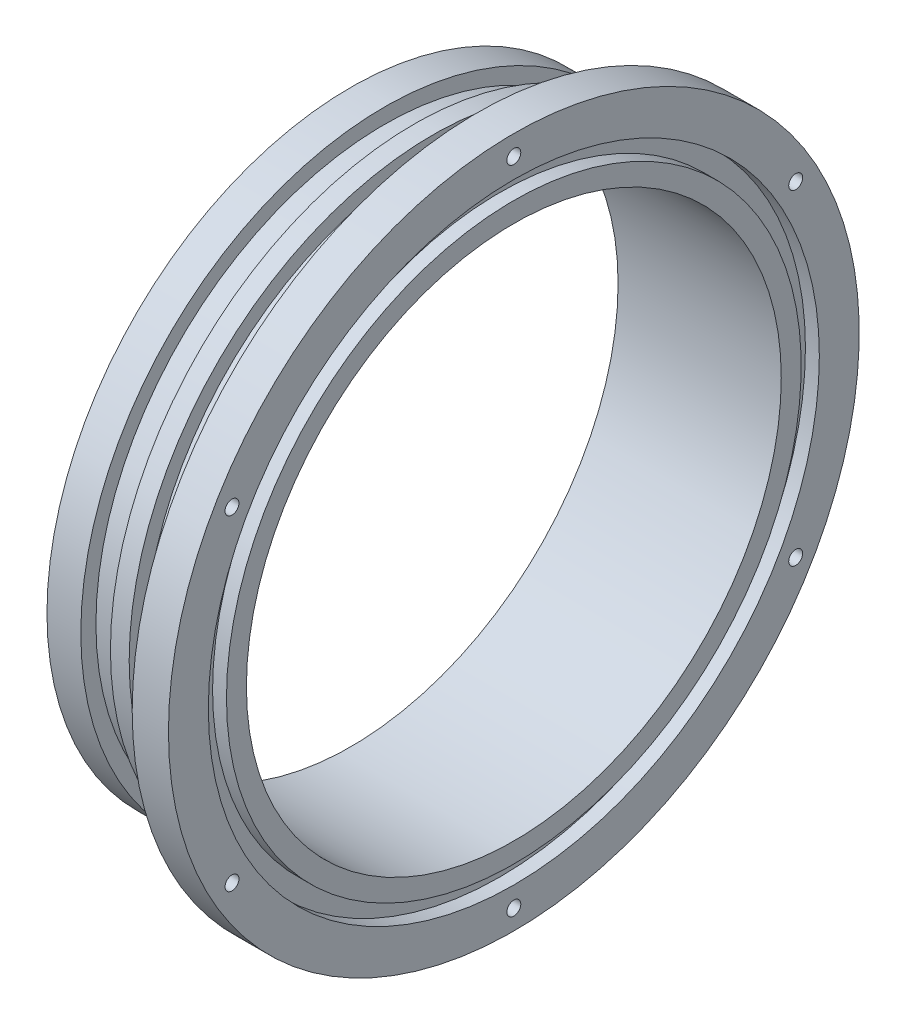
ISO-10303-21;
HEADER;
FILE_DESCRIPTION(('STEP AP214'),'2;1');
FILE_NAME('part.step','',(''),(''),'','','');
FILE_SCHEMA(('AUTOMOTIVE_DESIGN { 1 0 10303 214 1 1 1 1 }'));
ENDSEC;
DATA;
#1=APPLICATION_CONTEXT('core data for automotive mechanical design processes');
#2=APPLICATION_PROTOCOL_DEFINITION('international standard','automotive_design',2000,#1);
#3=PRODUCT_CONTEXT('',#1,'mechanical');
#4=PRODUCT('Part','Part','',(#3));
#5=PRODUCT_RELATED_PRODUCT_CATEGORY('part','',(#4));
#6=PRODUCT_DEFINITION_FORMATION('','',#4);
#7=PRODUCT_DEFINITION_CONTEXT('part definition',#1,'design');
#8=PRODUCT_DEFINITION('design','',#6,#7);
#9=PRODUCT_DEFINITION_SHAPE('','',#8);
#10=(LENGTH_UNIT() NAMED_UNIT(*) SI_UNIT(.MILLI.,.METRE.));
#11=(NAMED_UNIT(*) PLANE_ANGLE_UNIT() SI_UNIT($,.RADIAN.));
#12=(NAMED_UNIT(*) SI_UNIT($,.STERADIAN.) SOLID_ANGLE_UNIT());
#13=UNCERTAINTY_MEASURE_WITH_UNIT(LENGTH_MEASURE(1.E-05),#10,'distance_accuracy_value','');
#14=(GEOMETRIC_REPRESENTATION_CONTEXT(3) GLOBAL_UNCERTAINTY_ASSIGNED_CONTEXT((#13)) GLOBAL_UNIT_ASSIGNED_CONTEXT((#10,
#11,#12)) REPRESENTATION_CONTEXT('',''));
#15=CARTESIAN_POINT('',(0.,0.,0.));
#16=DIRECTION('',(0.,0.,1.));
#17=DIRECTION('',(1.,0.,0.));
#18=AXIS2_PLACEMENT_3D('',#15,#16,#17);
#19=CARTESIAN_POINT('',(0.,50.25,0.));
#20=DIRECTION('',(1.,0.,0.));
#21=DIRECTION('',(0.,0.,-1.));
#22=AXIS2_PLACEMENT_3D('',#19,#20,#21);
#23=PLANE('',#22);
#24=CARTESIAN_POINT('',(0.,0.,-47.));
#25=DIRECTION('',(-1.,0.,0.));
#26=DIRECTION('',(0.,0.,1.));
#27=AXIS2_PLACEMENT_3D('',#24,#25,#26);
#28=CIRCLE('',#27,1.15);
#29=CARTESIAN_POINT('',(0.,0.,-45.85));
#30=VERTEX_POINT('',#29);
#31=EDGE_CURVE('E254',#30,#30,#28,.T.);
#32=ORIENTED_EDGE('',*,*,#31,.F.);
#33=EDGE_LOOP('',(#32));
#34=FACE_BOUND('',#33,.T.);
#35=CARTESIAN_POINT('',(0.,47.,0.));
#36=DIRECTION('',(-1.,0.,0.));
#37=DIRECTION('',(0.,0.,1.));
#38=AXIS2_PLACEMENT_3D('',#35,#36,#37);
#39=CIRCLE('',#38,1.15);
#40=CARTESIAN_POINT('',(0.,47.,1.15));
#41=VERTEX_POINT('',#40);
#42=EDGE_CURVE('E265',#41,#41,#39,.T.);
#43=ORIENTED_EDGE('',*,*,#42,.F.);
#44=EDGE_LOOP('',(#43));
#45=FACE_BOUND('',#44,.T.);
#46=CARTESIAN_POINT('',(0.,0.,47.));
#47=DIRECTION('',(-1.,0.,0.));
#48=DIRECTION('',(0.,0.,1.));
#49=AXIS2_PLACEMENT_3D('',#46,#47,#48);
#50=CIRCLE('',#49,1.15);
#51=CARTESIAN_POINT('',(0.,0.,48.15));
#52=VERTEX_POINT('',#51);
#53=EDGE_CURVE('E271',#52,#52,#50,.T.);
#54=ORIENTED_EDGE('',*,*,#53,.F.);
#55=EDGE_LOOP('',(#54));
#56=FACE_BOUND('',#55,.T.);
#57=CARTESIAN_POINT('',(0.,-47.,0.));
#58=DIRECTION('',(-1.,0.,0.));
#59=DIRECTION('',(0.,0.,1.));
#60=AXIS2_PLACEMENT_3D('',#57,#58,#59);
#61=CIRCLE('',#60,1.15);
#62=CARTESIAN_POINT('',(0.,-47.,1.15));
#63=VERTEX_POINT('',#62);
#64=EDGE_CURVE('E253',#63,#63,#61,.T.);
#65=ORIENTED_EDGE('',*,*,#64,.F.);
#66=EDGE_LOOP('',(#65));
#67=FACE_BOUND('',#66,.T.);
#68=CARTESIAN_POINT('',(0.,0.,0.));
#69=DIRECTION('',(-1.,0.,0.));
#70=DIRECTION('',(0.,0.,1.));
#71=AXIS2_PLACEMENT_3D('',#68,#69,#70);
#72=CIRCLE('',#71,44.25);
#73=CARTESIAN_POINT('',(0.,0.,44.25));
#74=VERTEX_POINT('',#73);
#75=EDGE_CURVE('E10',#74,#74,#72,.T.);
#76=ORIENTED_EDGE('',*,*,#75,.F.);
#77=EDGE_LOOP('',(#76));
#78=FACE_BOUND('',#77,.T.);
#79=CARTESIAN_POINT('',(0.,0.,0.));
#80=DIRECTION('',(-1.,0.,0.));
#81=DIRECTION('',(0.,0.,1.));
#82=AXIS2_PLACEMENT_3D('',#79,#80,#81);
#83=CIRCLE('',#82,50.25);
#84=CARTESIAN_POINT('',(0.,0.,50.25));
#85=VERTEX_POINT('',#84);
#86=EDGE_CURVE('E49',#85,#85,#83,.T.);
#87=ORIENTED_EDGE('',*,*,#86,.T.);
#88=EDGE_LOOP('',(#87));
#89=FACE_BOUND('',#88,.T.);
#90=ADVANCED_FACE('F30',(#34,#45,#56,#67,#78,#89),#23,.F.);
#91=CARTESIAN_POINT('',(0.,0.,0.));
#92=DIRECTION('',(-1.,0.,0.));
#93=DIRECTION('',(0.,0.,1.));
#94=AXIS2_PLACEMENT_3D('',#91,#92,#93);
#95=CYLINDRICAL_SURFACE('',#94,44.25);
#96=CARTESIAN_POINT('',(27.,0.,0.));
#97=DIRECTION('',(-1.,0.,0.));
#98=DIRECTION('',(0.,0.,1.));
#99=AXIS2_PLACEMENT_3D('',#96,#97,#98);
#100=CIRCLE('',#99,44.25);
#101=CARTESIAN_POINT('',(27.,0.,44.25));
#102=VERTEX_POINT('',#101);
#103=EDGE_CURVE('E37',#102,#102,#100,.T.);
#104=ORIENTED_EDGE('',*,*,#103,.F.);
#105=EDGE_LOOP('',(#104));
#106=FACE_BOUND('',#105,.T.);
#107=ORIENTED_EDGE('',*,*,#75,.T.);
#108=EDGE_LOOP('',(#107));
#109=FACE_BOUND('',#108,.T.);
#110=ADVANCED_FACE('F126',(#106,#109),#95,.F.);
#111=CARTESIAN_POINT('',(27.,44.25,0.));
#112=DIRECTION('',(-1.,0.,0.));
#113=DIRECTION('',(0.,0.,1.));
#114=AXIS2_PLACEMENT_3D('',#111,#112,#113);
#115=PLANE('',#114);
#116=CARTESIAN_POINT('',(27.,0.,0.));
#117=DIRECTION('',(-1.,0.,0.));
#118=DIRECTION('',(0.,0.,1.));
#119=AXIS2_PLACEMENT_3D('',#116,#117,#118);
#120=CIRCLE('',#119,47.55);
#121=CARTESIAN_POINT('',(27.,0.,47.55));
#122=VERTEX_POINT('',#121);
#123=EDGE_CURVE('E42',#122,#122,#120,.T.);
#124=ORIENTED_EDGE('',*,*,#123,.F.);
#125=EDGE_LOOP('',(#124));
#126=FACE_BOUND('',#125,.T.);
#127=ORIENTED_EDGE('',*,*,#103,.T.);
#128=EDGE_LOOP('',(#127));
#129=FACE_BOUND('',#128,.T.);
#130=ADVANCED_FACE('F123',(#126,#129),#115,.F.);
#131=CARTESIAN_POINT('',(0.,0.,0.));
#132=DIRECTION('',(-1.,0.,0.));
#133=DIRECTION('',(0.,0.,1.));
#134=AXIS2_PLACEMENT_3D('',#131,#132,#133);
#135=CYLINDRICAL_SURFACE('',#134,47.55);
#136=CARTESIAN_POINT('',(24.7,0.,0.));
#137=DIRECTION('',(-1.,0.,0.));
#138=DIRECTION('',(0.,0.,1.));
#139=AXIS2_PLACEMENT_3D('',#136,#137,#138);
#140=CIRCLE('',#139,47.55);
#141=CARTESIAN_POINT('',(24.7,0.,47.55));
#142=VERTEX_POINT('',#141);
#143=EDGE_CURVE('E116',#142,#142,#140,.T.);
#144=ORIENTED_EDGE('',*,*,#143,.F.);
#145=EDGE_LOOP('',(#144));
#146=FACE_BOUND('',#145,.T.);
#147=ORIENTED_EDGE('',*,*,#123,.T.);
#148=EDGE_LOOP('',(#147));
#149=FACE_BOUND('',#148,.T.);
#150=ADVANCED_FACE('F121',(#146,#149),#135,.T.);
#151=CARTESIAN_POINT('',(24.7,47.55,0.));
#152=DIRECTION('',(-1.,0.,0.));
#153=DIRECTION('',(0.,0.,1.));
#154=AXIS2_PLACEMENT_3D('',#151,#152,#153);
#155=PLANE('',#154);
#156=CARTESIAN_POINT('',(24.7,0.,0.));
#157=DIRECTION('',(-1.,0.,0.));
#158=DIRECTION('',(0.,0.,1.));
#159=AXIS2_PLACEMENT_3D('',#156,#157,#158);
#160=CIRCLE('',#159,50.55);
#161=CARTESIAN_POINT('',(24.7,0.,50.55));
#162=VERTEX_POINT('',#161);
#163=EDGE_CURVE('E113',#162,#162,#160,.T.);
#164=ORIENTED_EDGE('',*,*,#163,.F.);
#165=EDGE_LOOP('',(#164));
#166=FACE_BOUND('',#165,.T.);
#167=ORIENTED_EDGE('',*,*,#143,.T.);
#168=EDGE_LOOP('',(#167));
#169=FACE_BOUND('',#168,.T.);
#170=ADVANCED_FACE('F138',(#166,#169),#155,.F.);
#171=CARTESIAN_POINT('',(0.,0.,0.));
#172=DIRECTION('',(-1.,0.,0.));
#173=DIRECTION('',(0.,0.,1.));
#174=AXIS2_PLACEMENT_3D('',#171,#172,#173);
#175=CYLINDRICAL_SURFACE('',#174,50.55);
#176=CARTESIAN_POINT('',(27.,0.,0.));
#177=DIRECTION('',(-1.,0.,0.));
#178=DIRECTION('',(0.,0.,1.));
#179=AXIS2_PLACEMENT_3D('',#176,#177,#178);
#180=CIRCLE('',#179,50.55);
#181=CARTESIAN_POINT('',(27.,0.,50.55));
#182=VERTEX_POINT('',#181);
#183=EDGE_CURVE('E110',#182,#182,#180,.T.);
#184=ORIENTED_EDGE('',*,*,#183,.F.);
#185=EDGE_LOOP('',(#184));
#186=FACE_BOUND('',#185,.T.);
#187=ORIENTED_EDGE('',*,*,#163,.T.);
#188=EDGE_LOOP('',(#187));
#189=FACE_BOUND('',#188,.T.);
#190=ADVANCED_FACE('F142',(#186,#189),#175,.F.);
#191=CARTESIAN_POINT('',(27.,50.55,0.));
#192=DIRECTION('',(-1.,0.,0.));
#193=DIRECTION('',(0.,0.,1.));
#194=AXIS2_PLACEMENT_3D('',#191,#192,#193);
#195=PLANE('',#194);
#196=CARTESIAN_POINT('',(27.,26.925000000002,-46.6354679937931));
#197=DIRECTION('',(1.,0.,0.));
#198=DIRECTION('',(0.,0.,-1.));
#199=AXIS2_PLACEMENT_3D('',#196,#197,#198);
#200=CIRCLE('',#199,1.15);
#201=CARTESIAN_POINT('',(27.,26.925000000002,-47.7854679937931));
#202=VERTEX_POINT('',#201);
#203=EDGE_CURVE('E55',#202,#202,#200,.T.);
#204=ORIENTED_EDGE('',*,*,#203,.F.);
#205=EDGE_LOOP('',(#204));
#206=FACE_BOUND('',#205,.T.);
#207=CARTESIAN_POINT('',(27.,-26.924999999998,-46.6354679937955));
#208=DIRECTION('',(1.,0.,0.));
#209=DIRECTION('',(0.,0.,-1.));
#210=AXIS2_PLACEMENT_3D('',#207,#208,#209);
#211=CIRCLE('',#210,1.15);
#212=CARTESIAN_POINT('',(27.,-26.924999999998,-47.7854679937955));
#213=VERTEX_POINT('',#212);
#214=EDGE_CURVE('E278',#213,#213,#211,.T.);
#215=ORIENTED_EDGE('',*,*,#214,.F.);
#216=EDGE_LOOP('',(#215));
#217=FACE_BOUND('',#216,.T.);
#218=CARTESIAN_POINT('',(27.,-53.85,-4.57793357901123E-12));
#219=DIRECTION('',(1.,0.,0.));
#220=DIRECTION('',(0.,0.,-1.));
#221=AXIS2_PLACEMENT_3D('',#218,#219,#220);
#222=CIRCLE('',#221,1.15);
#223=CARTESIAN_POINT('',(27.,-53.85,-1.15000000000458));
#224=VERTEX_POINT('',#223);
#225=EDGE_CURVE('E281',#224,#224,#222,.T.);
#226=ORIENTED_EDGE('',*,*,#225,.F.);
#227=EDGE_LOOP('',(#226));
#228=FACE_BOUND('',#227,.T.);
#229=CARTESIAN_POINT('',(27.,-26.925000000002,46.6354679937886));
#230=DIRECTION('',(1.,0.,0.));
#231=DIRECTION('',(0.,0.,-1.));
#232=AXIS2_PLACEMENT_3D('',#229,#230,#231);
#233=CIRCLE('',#232,1.15);
#234=CARTESIAN_POINT('',(27.,-26.925000000002,45.4854679937886));
#235=VERTEX_POINT('',#234);
#236=EDGE_CURVE('E283',#235,#235,#233,.T.);
#237=ORIENTED_EDGE('',*,*,#236,.F.);
#238=EDGE_LOOP('',(#237));
#239=FACE_BOUND('',#238,.T.);
#240=CARTESIAN_POINT('',(27.,26.924999999998,46.6354679937909));
#241=DIRECTION('',(1.,0.,0.));
#242=DIRECTION('',(0.,0.,-1.));
#243=AXIS2_PLACEMENT_3D('',#240,#241,#242);
#244=CIRCLE('',#243,1.15);
#245=CARTESIAN_POINT('',(27.,26.924999999998,45.4854679937909));
#246=VERTEX_POINT('',#245);
#247=EDGE_CURVE('E73',#246,#246,#244,.T.);
#248=ORIENTED_EDGE('',*,*,#247,.F.);
#249=EDGE_LOOP('',(#248));
#250=FACE_BOUND('',#249,.T.);
#251=CARTESIAN_POINT('',(27.,53.85,0.));
#252=DIRECTION('',(1.,0.,0.));
#253=DIRECTION('',(0.,0.,-1.));
#254=AXIS2_PLACEMENT_3D('',#251,#252,#253);
#255=CIRCLE('',#254,1.15);
#256=CARTESIAN_POINT('',(27.,53.85,-1.15));
#257=VERTEX_POINT('',#256);
#258=EDGE_CURVE('E50',#257,#257,#255,.T.);
#259=ORIENTED_EDGE('',*,*,#258,.F.);
#260=EDGE_LOOP('',(#259));
#261=FACE_BOUND('',#260,.T.);
#262=CARTESIAN_POINT('',(27.,0.,0.));
#263=DIRECTION('',(-1.,0.,0.));
#264=DIRECTION('',(0.,0.,1.));
#265=AXIS2_PLACEMENT_3D('',#262,#263,#264);
#266=CIRCLE('',#265,57.15);
#267=CARTESIAN_POINT('',(27.,0.,57.15));
#268=VERTEX_POINT('',#267);
#269=EDGE_CURVE('E107',#268,#268,#266,.T.);
#270=ORIENTED_EDGE('',*,*,#269,.F.);
#271=EDGE_LOOP('',(#270));
#272=FACE_BOUND('',#271,.T.);
#273=ORIENTED_EDGE('',*,*,#183,.T.);
#274=EDGE_LOOP('',(#273));
#275=FACE_BOUND('',#274,.T.);
#276=ADVANCED_FACE('F146',(#206,#217,#228,#239,#250,#261,#272,#275),#195,.F.);
#277=CARTESIAN_POINT('',(0.,0.,0.));
#278=DIRECTION('',(-1.,0.,0.));
#279=DIRECTION('',(0.,0.,1.));
#280=AXIS2_PLACEMENT_3D('',#277,#278,#279);
#281=CYLINDRICAL_SURFACE('',#280,57.15);
#282=CARTESIAN_POINT('',(21.,0.,0.));
#283=DIRECTION('',(-1.,0.,0.));
#284=DIRECTION('',(0.,0.,1.));
#285=AXIS2_PLACEMENT_3D('',#282,#283,#284);
#286=CIRCLE('',#285,57.15);
#287=CARTESIAN_POINT('',(21.,0.,57.15));
#288=VERTEX_POINT('',#287);
#289=EDGE_CURVE('E104',#288,#288,#286,.T.);
#290=ORIENTED_EDGE('',*,*,#289,.F.);
#291=EDGE_LOOP('',(#290));
#292=FACE_BOUND('',#291,.T.);
#293=ORIENTED_EDGE('',*,*,#269,.T.);
#294=EDGE_LOOP('',(#293));
#295=FACE_BOUND('',#294,.T.);
#296=ADVANCED_FACE('F150',(#292,#295),#281,.T.);
#297=CARTESIAN_POINT('',(21.,57.15,0.));
#298=DIRECTION('',(1.,0.,0.));
#299=DIRECTION('',(0.,0.,-1.));
#300=AXIS2_PLACEMENT_3D('',#297,#298,#299);
#301=PLANE('',#300);
#302=CARTESIAN_POINT('',(21.,26.925000000002,-46.6354679937931));
#303=DIRECTION('',(1.,0.,0.));
#304=DIRECTION('',(0.,0.,-1.));
#305=AXIS2_PLACEMENT_3D('',#302,#303,#304);
#306=CIRCLE('',#305,1.15);
#307=CARTESIAN_POINT('',(21.,26.925000000002,-47.7854679937931));
#308=VERTEX_POINT('',#307);
#309=EDGE_CURVE('E33',#308,#308,#306,.T.);
#310=ORIENTED_EDGE('',*,*,#309,.T.);
#311=EDGE_LOOP('',(#310));
#312=FACE_BOUND('',#311,.T.);
#313=CARTESIAN_POINT('',(21.,-26.924999999998,-46.6354679937955));
#314=DIRECTION('',(1.,0.,0.));
#315=DIRECTION('',(0.,0.,-1.));
#316=AXIS2_PLACEMENT_3D('',#313,#314,#315);
#317=CIRCLE('',#316,1.15);
#318=CARTESIAN_POINT('',(21.,-26.924999999998,-47.7854679937955));
#319=VERTEX_POINT('',#318);
#320=EDGE_CURVE('E60',#319,#319,#317,.T.);
#321=ORIENTED_EDGE('',*,*,#320,.T.);
#322=EDGE_LOOP('',(#321));
#323=FACE_BOUND('',#322,.T.);
#324=CARTESIAN_POINT('',(21.,-53.85,-4.57793357901123E-12));
#325=DIRECTION('',(1.,0.,0.));
#326=DIRECTION('',(0.,0.,-1.));
#327=AXIS2_PLACEMENT_3D('',#324,#325,#326);
#328=CIRCLE('',#327,1.15);
#329=CARTESIAN_POINT('',(21.,-53.85,-1.15000000000458));
#330=VERTEX_POINT('',#329);
#331=EDGE_CURVE('E58',#330,#330,#328,.T.);
#332=ORIENTED_EDGE('',*,*,#331,.T.);
#333=EDGE_LOOP('',(#332));
#334=FACE_BOUND('',#333,.T.);
#335=CARTESIAN_POINT('',(21.,-26.925000000002,46.6354679937886));
#336=DIRECTION('',(1.,0.,0.));
#337=DIRECTION('',(0.,0.,-1.));
#338=AXIS2_PLACEMENT_3D('',#335,#336,#337);
#339=CIRCLE('',#338,1.15);
#340=CARTESIAN_POINT('',(21.,-26.925000000002,45.4854679937886));
#341=VERTEX_POINT('',#340);
#342=EDGE_CURVE('E54',#341,#341,#339,.T.);
#343=ORIENTED_EDGE('',*,*,#342,.T.);
#344=EDGE_LOOP('',(#343));
#345=FACE_BOUND('',#344,.T.);
#346=CARTESIAN_POINT('',(21.,26.924999999998,46.6354679937909));
#347=DIRECTION('',(1.,0.,0.));
#348=DIRECTION('',(0.,0.,-1.));
#349=AXIS2_PLACEMENT_3D('',#346,#347,#348);
#350=CIRCLE('',#349,1.15);
#351=CARTESIAN_POINT('',(21.,26.924999999998,45.4854679937909));
#352=VERTEX_POINT('',#351);
#353=EDGE_CURVE('E51',#352,#352,#350,.T.);
#354=ORIENTED_EDGE('',*,*,#353,.T.);
#355=EDGE_LOOP('',(#354));
#356=FACE_BOUND('',#355,.T.);
#357=CARTESIAN_POINT('',(21.,53.85,0.));
#358=DIRECTION('',(1.,0.,0.));
#359=DIRECTION('',(0.,0.,-1.));
#360=AXIS2_PLACEMENT_3D('',#357,#358,#359);
#361=CIRCLE('',#360,1.15);
#362=CARTESIAN_POINT('',(21.,53.85,-1.15));
#363=VERTEX_POINT('',#362);
#364=EDGE_CURVE('E46',#363,#363,#361,.T.);
#365=ORIENTED_EDGE('',*,*,#364,.T.);
#366=EDGE_LOOP('',(#365));
#367=FACE_BOUND('',#366,.T.);
#368=CARTESIAN_POINT('',(21.,0.,0.));
#369=DIRECTION('',(-1.,0.,0.));
#370=DIRECTION('',(0.,0.,1.));
#371=AXIS2_PLACEMENT_3D('',#368,#369,#370);
#372=CIRCLE('',#371,50.25);
#373=CARTESIAN_POINT('',(21.,0.,50.25));
#374=VERTEX_POINT('',#373);
#375=EDGE_CURVE('E101',#374,#374,#372,.T.);
#376=ORIENTED_EDGE('',*,*,#375,.F.);
#377=EDGE_LOOP('',(#376));
#378=FACE_BOUND('',#377,.T.);
#379=ORIENTED_EDGE('',*,*,#289,.T.);
#380=EDGE_LOOP('',(#379));
#381=FACE_BOUND('',#380,.T.);
#382=ADVANCED_FACE('F154',(#312,#323,#334,#345,#356,#367,#378,#381),#301,.F.);
#383=CARTESIAN_POINT('',(0.,0.,0.));
#384=DIRECTION('',(-1.,0.,0.));
#385=DIRECTION('',(0.,0.,1.));
#386=AXIS2_PLACEMENT_3D('',#383,#384,#385);
#387=CYLINDRICAL_SURFACE('',#386,50.25);
#388=CARTESIAN_POINT('',(18.4,0.,0.));
#389=DIRECTION('',(-1.,0.,0.));
#390=DIRECTION('',(0.,0.,1.));
#391=AXIS2_PLACEMENT_3D('',#388,#389,#390);
#392=CIRCLE('',#391,50.25);
#393=CARTESIAN_POINT('',(18.4,0.,50.25));
#394=VERTEX_POINT('',#393);
#395=EDGE_CURVE('E98',#394,#394,#392,.T.);
#396=ORIENTED_EDGE('',*,*,#395,.F.);
#397=EDGE_LOOP('',(#396));
#398=FACE_BOUND('',#397,.T.);
#399=ORIENTED_EDGE('',*,*,#375,.T.);
#400=EDGE_LOOP('',(#399));
#401=FACE_BOUND('',#400,.T.);
#402=ADVANCED_FACE('F158',(#398,#401),#387,.T.);
#403=CARTESIAN_POINT('',(18.4,50.25,0.));
#404=DIRECTION('',(1.,0.,0.));
#405=DIRECTION('',(0.,0.,-1.));
#406=AXIS2_PLACEMENT_3D('',#403,#404,#405);
#407=PLANE('',#406);
#408=CARTESIAN_POINT('',(18.4,0.,0.));
#409=DIRECTION('',(-1.,0.,0.));
#410=DIRECTION('',(0.,0.,1.));
#411=AXIS2_PLACEMENT_3D('',#408,#409,#410);
#412=CIRCLE('',#411,47.75);
#413=CARTESIAN_POINT('',(18.4,0.,47.75));
#414=VERTEX_POINT('',#413);
#415=EDGE_CURVE('E95',#414,#414,#412,.T.);
#416=ORIENTED_EDGE('',*,*,#415,.F.);
#417=EDGE_LOOP('',(#416));
#418=FACE_BOUND('',#417,.T.);
#419=ORIENTED_EDGE('',*,*,#395,.T.);
#420=EDGE_LOOP('',(#419));
#421=FACE_BOUND('',#420,.T.);
#422=ADVANCED_FACE('F161',(#418,#421),#407,.F.);
#423=CARTESIAN_POINT('',(0.,0.,0.));
#424=DIRECTION('',(-1.,0.,0.));
#425=DIRECTION('',(0.,0.,1.));
#426=AXIS2_PLACEMENT_3D('',#423,#424,#425);
#427=CYLINDRICAL_SURFACE('',#426,47.75);
#428=CARTESIAN_POINT('',(13.6,0.,0.));
#429=DIRECTION('',(-1.,0.,0.));
#430=DIRECTION('',(0.,0.,1.));
#431=AXIS2_PLACEMENT_3D('',#428,#429,#430);
#432=CIRCLE('',#431,47.75);
#433=CARTESIAN_POINT('',(13.6,0.,47.75));
#434=VERTEX_POINT('',#433);
#435=EDGE_CURVE('E92',#434,#434,#432,.T.);
#436=ORIENTED_EDGE('',*,*,#435,.F.);
#437=EDGE_LOOP('',(#436));
#438=FACE_BOUND('',#437,.T.);
#439=ORIENTED_EDGE('',*,*,#415,.T.);
#440=EDGE_LOOP('',(#439));
#441=FACE_BOUND('',#440,.T.);
#442=ADVANCED_FACE('F165',(#438,#441),#427,.T.);
#443=CARTESIAN_POINT('',(13.6,47.75,0.));
#444=DIRECTION('',(-1.,0.,0.));
#445=DIRECTION('',(0.,0.,1.));
#446=AXIS2_PLACEMENT_3D('',#443,#444,#445);
#447=PLANE('',#446);
#448=CARTESIAN_POINT('',(13.6,0.,0.));
#449=DIRECTION('',(-1.,0.,0.));
#450=DIRECTION('',(0.,0.,1.));
#451=AXIS2_PLACEMENT_3D('',#448,#449,#450);
#452=CIRCLE('',#451,50.25);
#453=CARTESIAN_POINT('',(13.6,0.,50.25));
#454=VERTEX_POINT('',#453);
#455=EDGE_CURVE('E89',#454,#454,#452,.T.);
#456=ORIENTED_EDGE('',*,*,#455,.F.);
#457=EDGE_LOOP('',(#456));
#458=FACE_BOUND('',#457,.T.);
#459=ORIENTED_EDGE('',*,*,#435,.T.);
#460=EDGE_LOOP('',(#459));
#461=FACE_BOUND('',#460,.T.);
#462=ADVANCED_FACE('F169',(#458,#461),#447,.F.);
#463=CARTESIAN_POINT('',(0.,0.,0.));
#464=DIRECTION('',(-1.,0.,0.));
#465=DIRECTION('',(0.,0.,1.));
#466=AXIS2_PLACEMENT_3D('',#463,#464,#465);
#467=CYLINDRICAL_SURFACE('',#466,50.25);
#468=CARTESIAN_POINT('',(10.5,0.,0.));
#469=DIRECTION('',(-1.,0.,0.));
#470=DIRECTION('',(0.,0.,1.));
#471=AXIS2_PLACEMENT_3D('',#468,#469,#470);
#472=CIRCLE('',#471,50.25);
#473=CARTESIAN_POINT('',(10.5,0.,50.25));
#474=VERTEX_POINT('',#473);
#475=EDGE_CURVE('E86',#474,#474,#472,.T.);
#476=ORIENTED_EDGE('',*,*,#475,.F.);
#477=EDGE_LOOP('',(#476));
#478=FACE_BOUND('',#477,.T.);
#479=ORIENTED_EDGE('',*,*,#455,.T.);
#480=EDGE_LOOP('',(#479));
#481=FACE_BOUND('',#480,.T.);
#482=ADVANCED_FACE('F173',(#478,#481),#467,.T.);
#483=CARTESIAN_POINT('',(10.5,50.25,0.));
#484=DIRECTION('',(1.,0.,0.));
#485=DIRECTION('',(0.,0.,-1.));
#486=AXIS2_PLACEMENT_3D('',#483,#484,#485);
#487=PLANE('',#486);
#488=CARTESIAN_POINT('',(10.5,0.,0.));
#489=DIRECTION('',(-1.,0.,0.));
#490=DIRECTION('',(0.,0.,1.));
#491=AXIS2_PLACEMENT_3D('',#488,#489,#490);
#492=CIRCLE('',#491,47.75);
#493=CARTESIAN_POINT('',(10.5,0.,47.75));
#494=VERTEX_POINT('',#493);
#495=EDGE_CURVE('E83',#494,#494,#492,.T.);
#496=ORIENTED_EDGE('',*,*,#495,.F.);
#497=EDGE_LOOP('',(#496));
#498=FACE_BOUND('',#497,.T.);
#499=ORIENTED_EDGE('',*,*,#475,.T.);
#500=EDGE_LOOP('',(#499));
#501=FACE_BOUND('',#500,.T.);
#502=ADVANCED_FACE('F177',(#498,#501),#487,.F.);
#503=CARTESIAN_POINT('',(0.,0.,0.));
#504=DIRECTION('',(-1.,0.,0.));
#505=DIRECTION('',(0.,0.,1.));
#506=AXIS2_PLACEMENT_3D('',#503,#504,#505);
#507=CYLINDRICAL_SURFACE('',#506,47.75);
#508=CARTESIAN_POINT('',(5.6,0.,0.));
#509=DIRECTION('',(-1.,0.,0.));
#510=DIRECTION('',(0.,0.,1.));
#511=AXIS2_PLACEMENT_3D('',#508,#509,#510);
#512=CIRCLE('',#511,47.75);
#513=CARTESIAN_POINT('',(5.6,0.,47.75));
#514=VERTEX_POINT('',#513);
#515=EDGE_CURVE('E80',#514,#514,#512,.T.);
#516=ORIENTED_EDGE('',*,*,#515,.F.);
#517=EDGE_LOOP('',(#516));
#518=FACE_BOUND('',#517,.T.);
#519=ORIENTED_EDGE('',*,*,#495,.T.);
#520=EDGE_LOOP('',(#519));
#521=FACE_BOUND('',#520,.T.);
#522=ADVANCED_FACE('F181',(#518,#521),#507,.T.);
#523=CARTESIAN_POINT('',(5.6,47.75,0.));
#524=DIRECTION('',(-1.,0.,0.));
#525=DIRECTION('',(0.,0.,1.));
#526=AXIS2_PLACEMENT_3D('',#523,#524,#525);
#527=PLANE('',#526);
#528=CARTESIAN_POINT('',(5.6,0.,0.));
#529=DIRECTION('',(-1.,0.,0.));
#530=DIRECTION('',(0.,0.,1.));
#531=AXIS2_PLACEMENT_3D('',#528,#529,#530);
#532=CIRCLE('',#531,50.25);
#533=CARTESIAN_POINT('',(5.6,0.,50.25));
#534=VERTEX_POINT('',#533);
#535=EDGE_CURVE('E77',#534,#534,#532,.T.);
#536=ORIENTED_EDGE('',*,*,#535,.F.);
#537=EDGE_LOOP('',(#536));
#538=FACE_BOUND('',#537,.T.);
#539=ORIENTED_EDGE('',*,*,#515,.T.);
#540=EDGE_LOOP('',(#539));
#541=FACE_BOUND('',#540,.T.);
#542=ADVANCED_FACE('F185',(#538,#541),#527,.F.);
#543=CARTESIAN_POINT('',(0.,0.,0.));
#544=DIRECTION('',(-1.,0.,0.));
#545=DIRECTION('',(0.,0.,1.));
#546=AXIS2_PLACEMENT_3D('',#543,#544,#545);
#547=CYLINDRICAL_SURFACE('',#546,50.25);
#548=ORIENTED_EDGE('',*,*,#86,.F.);
#549=EDGE_LOOP('',(#548));
#550=FACE_BOUND('',#549,.T.);
#551=ORIENTED_EDGE('',*,*,#535,.T.);
#552=EDGE_LOOP('',(#551));
#553=FACE_BOUND('',#552,.T.);
#554=ADVANCED_FACE('F189',(#550,#553),#547,.T.);
#555=CARTESIAN_POINT('',(0.,53.85,0.));
#556=DIRECTION('',(1.,0.,0.));
#557=DIRECTION('',(0.,0.,-1.));
#558=AXIS2_PLACEMENT_3D('',#555,#556,#557);
#559=CYLINDRICAL_SURFACE('',#558,1.15);
#560=ORIENTED_EDGE('',*,*,#258,.T.);
#561=EDGE_LOOP('',(#560));
#562=FACE_BOUND('',#561,.T.);
#563=ORIENTED_EDGE('',*,*,#364,.F.);
#564=EDGE_LOOP('',(#563));
#565=FACE_BOUND('',#564,.T.);
#566=ADVANCED_FACE('F193',(#562,#565),#559,.F.);
#567=CARTESIAN_POINT('',(0.,26.924999999998,46.6354679937909));
#568=DIRECTION('',(1.,0.,0.));
#569=DIRECTION('',(0.,0.,-1.));
#570=AXIS2_PLACEMENT_3D('',#567,#568,#569);
#571=CYLINDRICAL_SURFACE('',#570,1.15);
#572=ORIENTED_EDGE('',*,*,#247,.T.);
#573=EDGE_LOOP('',(#572));
#574=FACE_BOUND('',#573,.T.);
#575=ORIENTED_EDGE('',*,*,#353,.F.);
#576=EDGE_LOOP('',(#575));
#577=FACE_BOUND('',#576,.T.);
#578=ADVANCED_FACE('F197',(#574,#577),#571,.F.);
#579=CARTESIAN_POINT('',(0.,-26.925000000002,46.6354679937886));
#580=DIRECTION('',(1.,0.,0.));
#581=DIRECTION('',(0.,0.,-1.));
#582=AXIS2_PLACEMENT_3D('',#579,#580,#581);
#583=CYLINDRICAL_SURFACE('',#582,1.15);
#584=ORIENTED_EDGE('',*,*,#236,.T.);
#585=EDGE_LOOP('',(#584));
#586=FACE_BOUND('',#585,.T.);
#587=ORIENTED_EDGE('',*,*,#342,.F.);
#588=EDGE_LOOP('',(#587));
#589=FACE_BOUND('',#588,.T.);
#590=ADVANCED_FACE('F200',(#586,#589),#583,.F.);
#591=CARTESIAN_POINT('',(0.,-53.85,-4.57793357901123E-12));
#592=DIRECTION('',(1.,0.,0.));
#593=DIRECTION('',(0.,0.,-1.));
#594=AXIS2_PLACEMENT_3D('',#591,#592,#593);
#595=CYLINDRICAL_SURFACE('',#594,1.15);
#596=ORIENTED_EDGE('',*,*,#225,.T.);
#597=EDGE_LOOP('',(#596));
#598=FACE_BOUND('',#597,.T.);
#599=ORIENTED_EDGE('',*,*,#331,.F.);
#600=EDGE_LOOP('',(#599));
#601=FACE_BOUND('',#600,.T.);
#602=ADVANCED_FACE('F204',(#598,#601),#595,.F.);
#603=CARTESIAN_POINT('',(0.,-26.924999999998,-46.6354679937955));
#604=DIRECTION('',(1.,0.,0.));
#605=DIRECTION('',(0.,0.,-1.));
#606=AXIS2_PLACEMENT_3D('',#603,#604,#605);
#607=CYLINDRICAL_SURFACE('',#606,1.15);
#608=ORIENTED_EDGE('',*,*,#214,.T.);
#609=EDGE_LOOP('',(#608));
#610=FACE_BOUND('',#609,.T.);
#611=ORIENTED_EDGE('',*,*,#320,.F.);
#612=EDGE_LOOP('',(#611));
#613=FACE_BOUND('',#612,.T.);
#614=ADVANCED_FACE('F208',(#610,#613),#607,.F.);
#615=CARTESIAN_POINT('',(0.,26.925000000002,-46.6354679937931));
#616=DIRECTION('',(1.,0.,0.));
#617=DIRECTION('',(0.,0.,-1.));
#618=AXIS2_PLACEMENT_3D('',#615,#616,#617);
#619=CYLINDRICAL_SURFACE('',#618,1.15);
#620=ORIENTED_EDGE('',*,*,#203,.T.);
#621=EDGE_LOOP('',(#620));
#622=FACE_BOUND('',#621,.T.);
#623=ORIENTED_EDGE('',*,*,#309,.F.);
#624=EDGE_LOOP('',(#623));
#625=FACE_BOUND('',#624,.T.);
#626=ADVANCED_FACE('F212',(#622,#625),#619,.F.);
#627=CARTESIAN_POINT('',(5.,-47.,0.));
#628=DIRECTION('',(-1.,0.,0.));
#629=DIRECTION('',(0.,0.,1.));
#630=AXIS2_PLACEMENT_3D('',#627,#628,#629);
#631=CYLINDRICAL_SURFACE('',#630,1.15);
#632=CARTESIAN_POINT('',(5.,-47.,0.));
#633=DIRECTION('',(-1.,0.,0.));
#634=DIRECTION('',(0.,0.,1.));
#635=AXIS2_PLACEMENT_3D('',#632,#633,#634);
#636=CIRCLE('',#635,1.15);
#637=CARTESIAN_POINT('',(5.,-47.,1.15));
#638=VERTEX_POINT('',#637);
#639=EDGE_CURVE('E257',#638,#638,#636,.T.);
#640=ORIENTED_EDGE('',*,*,#639,.F.);
#641=EDGE_LOOP('',(#640));
#642=FACE_BOUND('',#641,.T.);
#643=ORIENTED_EDGE('',*,*,#64,.T.);
#644=EDGE_LOOP('',(#643));
#645=FACE_BOUND('',#644,.T.);
#646=ADVANCED_FACE('F216',(#642,#645),#631,.F.);
#647=CARTESIAN_POINT('',(5.,-47.,0.));
#648=DIRECTION('',(-1.,0.,0.));
#649=DIRECTION('',(0.,0.,1.));
#650=AXIS2_PLACEMENT_3D('',#647,#648,#649);
#651=PLANE('',#650);
#652=ORIENTED_EDGE('',*,*,#639,.T.);
#653=EDGE_LOOP('',(#652));
#654=FACE_BOUND('',#653,.T.);
#655=ADVANCED_FACE('F220',(#654),#651,.T.);
#656=CARTESIAN_POINT('',(5.,0.,47.));
#657=DIRECTION('',(-1.,0.,0.));
#658=DIRECTION('',(0.,0.,1.));
#659=AXIS2_PLACEMENT_3D('',#656,#657,#658);
#660=CYLINDRICAL_SURFACE('',#659,1.15);
#661=CARTESIAN_POINT('',(5.,0.,47.));
#662=DIRECTION('',(-1.,0.,0.));
#663=DIRECTION('',(0.,0.,1.));
#664=AXIS2_PLACEMENT_3D('',#661,#662,#663);
#665=CIRCLE('',#664,1.15);
#666=CARTESIAN_POINT('',(5.,0.,48.15));
#667=VERTEX_POINT('',#666);
#668=EDGE_CURVE('E268',#667,#667,#665,.T.);
#669=ORIENTED_EDGE('',*,*,#668,.F.);
#670=EDGE_LOOP('',(#669));
#671=FACE_BOUND('',#670,.T.);
#672=ORIENTED_EDGE('',*,*,#53,.T.);
#673=EDGE_LOOP('',(#672));
#674=FACE_BOUND('',#673,.T.);
#675=ADVANCED_FACE('F224',(#671,#674),#660,.F.);
#676=CARTESIAN_POINT('',(5.,0.,47.));
#677=DIRECTION('',(-1.,0.,0.));
#678=DIRECTION('',(0.,0.,1.));
#679=AXIS2_PLACEMENT_3D('',#676,#677,#678);
#680=PLANE('',#679);
#681=ORIENTED_EDGE('',*,*,#668,.T.);
#682=EDGE_LOOP('',(#681));
#683=FACE_BOUND('',#682,.T.);
#684=ADVANCED_FACE('F228',(#683),#680,.T.);
#685=CARTESIAN_POINT('',(5.,47.,0.));
#686=DIRECTION('',(-1.,0.,0.));
#687=DIRECTION('',(0.,0.,1.));
#688=AXIS2_PLACEMENT_3D('',#685,#686,#687);
#689=CYLINDRICAL_SURFACE('',#688,1.15);
#690=CARTESIAN_POINT('',(5.,47.,0.));
#691=DIRECTION('',(-1.,0.,0.));
#692=DIRECTION('',(0.,0.,1.));
#693=AXIS2_PLACEMENT_3D('',#690,#691,#692);
#694=CIRCLE('',#693,1.15);
#695=CARTESIAN_POINT('',(5.,47.,1.15));
#696=VERTEX_POINT('',#695);
#697=EDGE_CURVE('E260',#696,#696,#694,.T.);
#698=ORIENTED_EDGE('',*,*,#697,.F.);
#699=EDGE_LOOP('',(#698));
#700=FACE_BOUND('',#699,.T.);
#701=ORIENTED_EDGE('',*,*,#42,.T.);
#702=EDGE_LOOP('',(#701));
#703=FACE_BOUND('',#702,.T.);
#704=ADVANCED_FACE('F232',(#700,#703),#689,.F.);
#705=CARTESIAN_POINT('',(5.,47.,0.));
#706=DIRECTION('',(-1.,0.,0.));
#707=DIRECTION('',(0.,0.,1.));
#708=AXIS2_PLACEMENT_3D('',#705,#706,#707);
#709=PLANE('',#708);
#710=ORIENTED_EDGE('',*,*,#697,.T.);
#711=EDGE_LOOP('',(#710));
#712=FACE_BOUND('',#711,.T.);
#713=ADVANCED_FACE('F236',(#712),#709,.T.);
#714=CARTESIAN_POINT('',(5.,0.,-47.));
#715=DIRECTION('',(-1.,0.,0.));
#716=DIRECTION('',(0.,0.,1.));
#717=AXIS2_PLACEMENT_3D('',#714,#715,#716);
#718=CYLINDRICAL_SURFACE('',#717,1.15);
#719=CARTESIAN_POINT('',(5.,0.,-47.));
#720=DIRECTION('',(-1.,0.,0.));
#721=DIRECTION('',(0.,0.,1.));
#722=AXIS2_PLACEMENT_3D('',#719,#720,#721);
#723=CIRCLE('',#722,1.15);
#724=CARTESIAN_POINT('',(5.,0.,-45.85));
#725=VERTEX_POINT('',#724);
#726=EDGE_CURVE('E252',#725,#725,#723,.T.);
#727=ORIENTED_EDGE('',*,*,#726,.F.);
#728=EDGE_LOOP('',(#727));
#729=FACE_BOUND('',#728,.T.);
#730=ORIENTED_EDGE('',*,*,#31,.T.);
#731=EDGE_LOOP('',(#730));
#732=FACE_BOUND('',#731,.T.);
#733=ADVANCED_FACE('F240',(#729,#732),#718,.F.);
#734=CARTESIAN_POINT('',(5.,0.,-47.));
#735=DIRECTION('',(-1.,0.,0.));
#736=DIRECTION('',(0.,0.,1.));
#737=AXIS2_PLACEMENT_3D('',#734,#735,#736);
#738=PLANE('',#737);
#739=ORIENTED_EDGE('',*,*,#726,.T.);
#740=EDGE_LOOP('',(#739));
#741=FACE_BOUND('',#740,.T.);
#742=ADVANCED_FACE('F244',(#741),#738,.T.);
#743=CLOSED_SHELL('',(#90,#110,#130,#150,#170,#190,#276,#296,#382,#402,#422,#442,#462,#482,#502,
#522,#542,#554,#566,#578,#590,#602,#614,#626,#646,#655,#675,#684,#704,#713,#733,#742));
#744=MANIFOLD_SOLID_BREP('B2',#743);
#745=ADVANCED_BREP_SHAPE_REPRESENTATION('',(#18,#744),#14);
#746=SHAPE_DEFINITION_REPRESENTATION(#9,#745);
ENDSEC;
END-ISO-10303-21;
